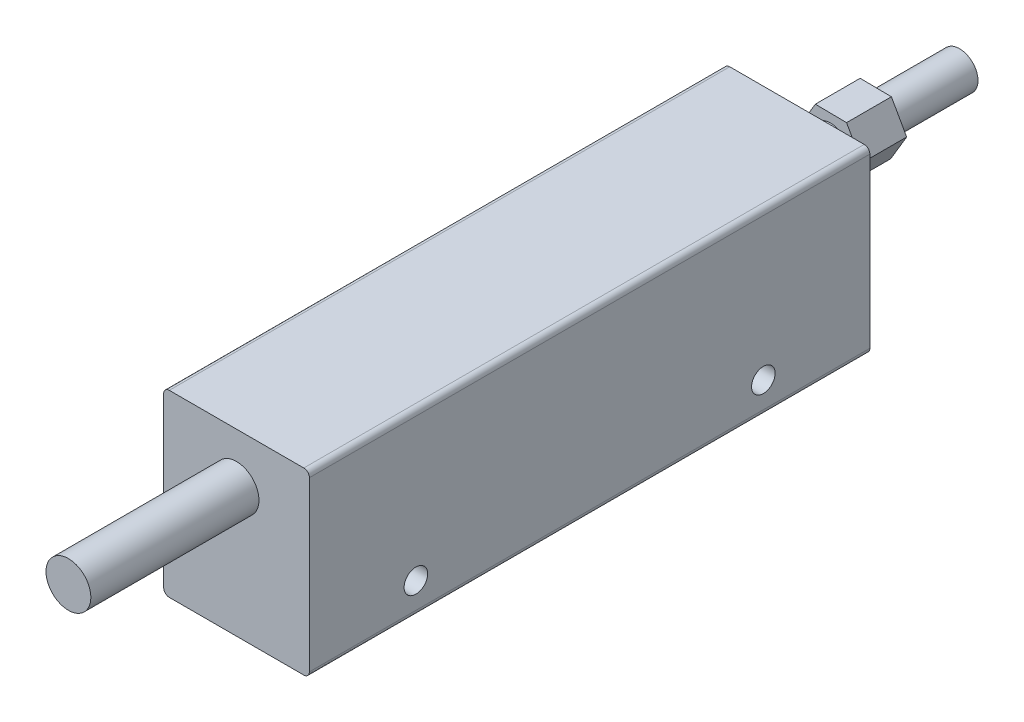
ISO-10303-21;
HEADER;
FILE_DESCRIPTION(('STEP AP214'),'2;1');
FILE_NAME('part.step','',(''),(''),'','','');
FILE_SCHEMA(('AUTOMOTIVE_DESIGN { 1 0 10303 214 1 1 1 1 }'));
ENDSEC;
DATA;
#1=APPLICATION_CONTEXT('core data for automotive mechanical design processes');
#2=APPLICATION_PROTOCOL_DEFINITION('international standard','automotive_design',2000,#1);
#3=PRODUCT_CONTEXT('',#1,'mechanical');
#4=PRODUCT('Part','Part','',(#3));
#5=PRODUCT_RELATED_PRODUCT_CATEGORY('part','',(#4));
#6=PRODUCT_DEFINITION_FORMATION('','',#4);
#7=PRODUCT_DEFINITION_CONTEXT('part definition',#1,'design');
#8=PRODUCT_DEFINITION('design','',#6,#7);
#9=PRODUCT_DEFINITION_SHAPE('','',#8);
#10=(LENGTH_UNIT() NAMED_UNIT(*) SI_UNIT(.MILLI.,.METRE.));
#11=(NAMED_UNIT(*) PLANE_ANGLE_UNIT() SI_UNIT($,.RADIAN.));
#12=(NAMED_UNIT(*) SI_UNIT($,.STERADIAN.) SOLID_ANGLE_UNIT());
#13=UNCERTAINTY_MEASURE_WITH_UNIT(LENGTH_MEASURE(1.E-05),#10,'distance_accuracy_value','');
#14=(GEOMETRIC_REPRESENTATION_CONTEXT(3) GLOBAL_UNCERTAINTY_ASSIGNED_CONTEXT((#13)) GLOBAL_UNIT_ASSIGNED_CONTEXT((#10,
#11,#12)) REPRESENTATION_CONTEXT('',''));
#15=CARTESIAN_POINT('',(0.,0.,0.));
#16=DIRECTION('',(0.,0.,1.));
#17=DIRECTION('',(1.,0.,0.));
#18=AXIS2_PLACEMENT_3D('',#15,#16,#17);
#19=CARTESIAN_POINT('',(6.5,11.5,-14.5));
#20=DIRECTION('',(0.,0.,1.));
#21=DIRECTION('',(1.,0.,0.));
#22=AXIS2_PLACEMENT_3D('',#19,#20,#21);
#23=CYLINDRICAL_SURFACE('',#22,1.65);
#24=CARTESIAN_POINT('',(6.5,11.5,0.));
#25=DIRECTION('',(0.,0.,-1.));
#26=DIRECTION('',(-1.,0.,0.));
#27=AXIS2_PLACEMENT_3D('',#24,#25,#26);
#28=CIRCLE('',#27,1.65);
#29=CARTESIAN_POINT('',(8.15,11.5,0.));
#30=VERTEX_POINT('',#29);
#31=EDGE_CURVE('E226',#30,#30,#28,.T.);
#32=CARTESIAN_POINT('',(6.5,11.5,-3.));
#33=DIRECTION('',(0.,0.,-1.));
#34=DIRECTION('',(-1.,0.,0.));
#35=AXIS2_PLACEMENT_3D('',#32,#33,#34);
#36=CIRCLE('',#35,1.65);
#37=CARTESIAN_POINT('',(8.15,11.5,-3.));
#38=VERTEX_POINT('',#37);
#39=EDGE_CURVE('E11',#38,#38,#36,.T.);
#40=CARTESIAN_POINT('',(8.15,11.5,0.));
#41=CARTESIAN_POINT('',(8.15,11.5,-0.03125));
#42=CARTESIAN_POINT('',(8.15,11.5,-0.0625000000000001));
#43=CARTESIAN_POINT('',(8.15,11.5,-0.125));
#44=CARTESIAN_POINT('',(8.15,11.5,-0.15625));
#45=CARTESIAN_POINT('',(8.15,11.5,-0.21875));
#46=CARTESIAN_POINT('',(8.15,11.5,-0.25));
#47=CARTESIAN_POINT('',(8.15,11.5,-0.3125));
#48=CARTESIAN_POINT('',(8.15,11.5,-0.34375));
#49=CARTESIAN_POINT('',(8.15,11.5,-0.40625));
#50=CARTESIAN_POINT('',(8.15,11.5,-0.4375));
#51=CARTESIAN_POINT('',(8.15,11.5,-0.5));
#52=CARTESIAN_POINT('',(8.15,11.5,-0.53125));
#53=CARTESIAN_POINT('',(8.15,11.5,-0.593750000000001));
#54=CARTESIAN_POINT('',(8.15,11.5,-0.625000000000001));
#55=CARTESIAN_POINT('',(8.15,11.5,-0.687500000000001));
#56=CARTESIAN_POINT('',(8.15,11.5,-0.718750000000001));
#57=CARTESIAN_POINT('',(8.15,11.5,-0.78125));
#58=CARTESIAN_POINT('',(8.15,11.5,-0.8125));
#59=CARTESIAN_POINT('',(8.15,11.5,-0.874999999999999));
#60=CARTESIAN_POINT('',(8.15,11.5,-0.906249999999999));
#61=CARTESIAN_POINT('',(8.15,11.5,-0.968749999999999));
#62=CARTESIAN_POINT('',(8.15,11.5,-0.999999999999999));
#63=CARTESIAN_POINT('',(8.15,11.5,-1.0625));
#64=CARTESIAN_POINT('',(8.15,11.5,-1.09375));
#65=CARTESIAN_POINT('',(8.15,11.5,-1.15625));
#66=CARTESIAN_POINT('',(8.15,11.5,-1.1875));
#67=CARTESIAN_POINT('',(8.15,11.5,-1.25));
#68=CARTESIAN_POINT('',(8.15,11.5,-1.28125));
#69=CARTESIAN_POINT('',(8.15,11.5,-1.34375));
#70=CARTESIAN_POINT('',(8.15,11.5,-1.375));
#71=CARTESIAN_POINT('',(8.15,11.5,-1.4375));
#72=CARTESIAN_POINT('',(8.15,11.5,-1.46875));
#73=CARTESIAN_POINT('',(8.15,11.5,-1.53125));
#74=CARTESIAN_POINT('',(8.15,11.5,-1.5625));
#75=CARTESIAN_POINT('',(8.15,11.5,-1.625));
#76=CARTESIAN_POINT('',(8.15,11.5,-1.65625));
#77=CARTESIAN_POINT('',(8.15,11.5,-1.71875));
#78=CARTESIAN_POINT('',(8.15,11.5,-1.75));
#79=CARTESIAN_POINT('',(8.15,11.5,-1.8125));
#80=CARTESIAN_POINT('',(8.15,11.5,-1.84375));
#81=CARTESIAN_POINT('',(8.15,11.5,-1.90625));
#82=CARTESIAN_POINT('',(8.15,11.5,-1.9375));
#83=CARTESIAN_POINT('',(8.15,11.5,-2.));
#84=CARTESIAN_POINT('',(8.15,11.5,-2.03125));
#85=CARTESIAN_POINT('',(8.15,11.5,-2.09375));
#86=CARTESIAN_POINT('',(8.15,11.5,-2.125));
#87=CARTESIAN_POINT('',(8.15,11.5,-2.1875));
#88=CARTESIAN_POINT('',(8.15,11.5,-2.21875));
#89=CARTESIAN_POINT('',(8.15,11.5,-2.28125));
#90=CARTESIAN_POINT('',(8.15,11.5,-2.3125));
#91=CARTESIAN_POINT('',(8.15,11.5,-2.375));
#92=CARTESIAN_POINT('',(8.15,11.5,-2.40625));
#93=CARTESIAN_POINT('',(8.15,11.5,-2.46875));
#94=CARTESIAN_POINT('',(8.15,11.5,-2.5));
#95=CARTESIAN_POINT('',(8.15,11.5,-2.5625));
#96=CARTESIAN_POINT('',(8.15,11.5,-2.59375));
#97=CARTESIAN_POINT('',(8.15,11.5,-2.65625));
#98=CARTESIAN_POINT('',(8.15,11.5,-2.6875));
#99=CARTESIAN_POINT('',(8.15,11.5,-2.75));
#100=CARTESIAN_POINT('',(8.15,11.5,-2.78125));
#101=CARTESIAN_POINT('',(8.15,11.5,-2.84375));
#102=CARTESIAN_POINT('',(8.15,11.5,-2.875));
#103=CARTESIAN_POINT('',(8.15,11.5,-2.9375));
#104=CARTESIAN_POINT('',(8.15,11.5,-2.96875));
#105=CARTESIAN_POINT('',(8.15,11.5,-3.));
#106=B_SPLINE_CURVE_WITH_KNOTS('',3,(#40,#41,#42,#43,#44,#45,#46,#47,#48,#49,#50,#51,#52,#53,
#54,#55,#56,#57,#58,#59,#60,#61,#62,#63,#64,#65,#66,#67,#68,#69,#70,#71,#72,#73,#74,#75,#76,#77,
#78,#79,#80,#81,#82,#83,#84,#85,#86,#87,#88,#89,#90,#91,#92,#93,#94,#95,#96,#97,#98,#99,#100,
#101,#102,#103,#104,#105),.UNSPECIFIED.,.F.,.F.,(4,2,2,2,2,2,2,2,2,2,2,2,2,2,2,2,2,2,2,2,2,2,2,
2,2,2,2,2,2,2,2,2,4),(0.,0.0937500000000001,0.1875,0.28125,0.375,0.46875,0.5625,
0.656250000000001,0.750000000000001,0.843749999999999,0.937499999999999,1.03125,1.125,1.21875,
1.3125,1.40625,1.5,1.59375,1.6875,1.78125,1.875,1.96875,2.0625,2.15625,2.25,2.34375,2.4375,
2.53125,2.625,2.71875,2.8125,2.90625,3.),.UNSPECIFIED.);
#107=EDGE_CURVE('BSEAM39',#30,#38,#106,.T.);
#108=ORIENTED_EDGE('',*,*,#31,.T.);
#109=ORIENTED_EDGE('',*,*,#39,.F.);
#110=ORIENTED_EDGE('',*,*,#107,.T.);
#111=ORIENTED_EDGE('',*,*,#107,.F.);
#112=EDGE_LOOP('',(#108,#110,#109,#111));
#113=FACE_BOUND('',#112,.T.);
#114=ADVANCED_FACE('F39',(#113),#23,.T.);
#115=CARTESIAN_POINT('',(0.,0.,50.));
#116=DIRECTION('',(1.,0.,0.));
#117=DIRECTION('',(0.,0.,-1.));
#118=AXIS2_PLACEMENT_3D('',#115,#116,#117);
#119=PLANE('',#118);
#120=CARTESIAN_POINT('',(0.,2.8,40.5));
#121=DIRECTION('',(1.,0.,0.));
#122=DIRECTION('',(0.,1.,0.));
#123=AXIS2_PLACEMENT_3D('',#120,#121,#122);
#124=CIRCLE('',#123,1.05);
#125=CARTESIAN_POINT('',(0.,3.85,40.5));
#126=VERTEX_POINT('',#125);
#127=EDGE_CURVE('E234',#126,#126,#124,.T.);
#128=ORIENTED_EDGE('',*,*,#127,.T.);
#129=EDGE_LOOP('',(#128));
#130=FACE_BOUND('',#129,.T.);
#131=CARTESIAN_POINT('',(0.,2.8,9.5));
#132=DIRECTION('',(1.,0.,0.));
#133=DIRECTION('',(0.,1.,0.));
#134=AXIS2_PLACEMENT_3D('',#131,#132,#133);
#135=CIRCLE('',#134,1.05);
#136=CARTESIAN_POINT('',(0.,3.85,9.5));
#137=VERTEX_POINT('',#136);
#138=EDGE_CURVE('E243',#137,#137,#135,.T.);
#139=ORIENTED_EDGE('',*,*,#138,.T.);
#140=EDGE_LOOP('',(#139));
#141=FACE_BOUND('',#140,.T.);
#142=DIRECTION('',(0.,-1.,0.));
#143=VECTOR('',#142,1.);
#144=CARTESIAN_POINT('',(0.,0.,0.));
#145=LINE('',#144,#143);
#146=CARTESIAN_POINT('',(0.,15.5,0.));
#147=VERTEX_POINT('',#146);
#148=CARTESIAN_POINT('',(0.,0.5,0.));
#149=VERTEX_POINT('',#148);
#150=EDGE_CURVE('E238',#147,#149,#145,.T.);
#151=ORIENTED_EDGE('',*,*,#150,.T.);
#152=DIRECTION('',(0.,0.,-1.));
#153=VECTOR('',#152,1.);
#154=CARTESIAN_POINT('',(0.,0.5,50.));
#155=LINE('',#154,#153);
#156=CARTESIAN_POINT('',(0.,0.5,50.));
#157=VERTEX_POINT('',#156);
#158=EDGE_CURVE('E323',#149,#157,#155,.F.);
#159=ORIENTED_EDGE('',*,*,#158,.T.);
#160=DIRECTION('',(0.,-1.,0.));
#161=VECTOR('',#160,1.);
#162=CARTESIAN_POINT('',(0.,0.,50.));
#163=LINE('',#162,#161);
#164=CARTESIAN_POINT('',(0.,15.5,50.));
#165=VERTEX_POINT('',#164);
#166=EDGE_CURVE('E250',#165,#157,#163,.T.);
#167=ORIENTED_EDGE('',*,*,#166,.F.);
#168=DIRECTION('',(0.,0.,-1.));
#169=VECTOR('',#168,1.);
#170=CARTESIAN_POINT('',(0.,15.5,50.));
#171=LINE('',#170,#169);
#172=EDGE_CURVE('E319',#165,#147,#171,.T.);
#173=ORIENTED_EDGE('',*,*,#172,.T.);
#174=EDGE_LOOP('',(#151,#159,#167,#173));
#175=FACE_BOUND('',#174,.T.);
#176=ADVANCED_FACE('F364',(#130,#141,#175),#119,.F.);
#177=CARTESIAN_POINT('',(0.,0.,50.));
#178=DIRECTION('',(0.,1.,0.));
#179=DIRECTION('',(0.,0.,1.));
#180=AXIS2_PLACEMENT_3D('',#177,#178,#179);
#181=PLANE('',#180);
#182=DIRECTION('',(1.,0.,0.));
#183=VECTOR('',#182,1.);
#184=CARTESIAN_POINT('',(0.,0.,0.));
#185=LINE('',#184,#183);
#186=CARTESIAN_POINT('',(0.5,0.,0.));
#187=VERTEX_POINT('',#186);
#188=CARTESIAN_POINT('',(12.5,0.,0.));
#189=VERTEX_POINT('',#188);
#190=EDGE_CURVE('E269',#187,#189,#185,.T.);
#191=ORIENTED_EDGE('',*,*,#190,.T.);
#192=DIRECTION('',(0.,0.,-1.));
#193=VECTOR('',#192,1.);
#194=CARTESIAN_POINT('',(12.5,0.,50.));
#195=LINE('',#194,#193);
#196=CARTESIAN_POINT('',(12.5,0.,50.));
#197=VERTEX_POINT('',#196);
#198=EDGE_CURVE('E305',#189,#197,#195,.F.);
#199=ORIENTED_EDGE('',*,*,#198,.T.);
#200=DIRECTION('',(1.,0.,0.));
#201=VECTOR('',#200,1.);
#202=CARTESIAN_POINT('',(0.,0.,50.));
#203=LINE('',#202,#201);
#204=CARTESIAN_POINT('',(0.5,0.,50.));
#205=VERTEX_POINT('',#204);
#206=EDGE_CURVE('E254',#205,#197,#203,.T.);
#207=ORIENTED_EDGE('',*,*,#206,.F.);
#208=DIRECTION('',(0.,0.,-1.));
#209=VECTOR('',#208,1.);
#210=CARTESIAN_POINT('',(0.5,0.,50.));
#211=LINE('',#210,#209);
#212=EDGE_CURVE('E301',#205,#187,#211,.T.);
#213=ORIENTED_EDGE('',*,*,#212,.T.);
#214=EDGE_LOOP('',(#191,#199,#207,#213));
#215=FACE_BOUND('',#214,.T.);
#216=ADVANCED_FACE('F370',(#215),#181,.F.);
#217=CARTESIAN_POINT('',(13.,0.,50.));
#218=DIRECTION('',(-1.,0.,0.));
#219=DIRECTION('',(0.,-1.,0.));
#220=AXIS2_PLACEMENT_3D('',#217,#218,#219);
#221=PLANE('',#220);
#222=CARTESIAN_POINT('',(13.,2.8,40.5));
#223=DIRECTION('',(1.,0.,0.));
#224=DIRECTION('',(0.,1.,0.));
#225=AXIS2_PLACEMENT_3D('',#222,#223,#224);
#226=CIRCLE('',#225,1.05);
#227=CARTESIAN_POINT('',(13.,3.85,40.5));
#228=VERTEX_POINT('',#227);
#229=EDGE_CURVE('E239',#228,#228,#226,.T.);
#230=ORIENTED_EDGE('',*,*,#229,.F.);
#231=EDGE_LOOP('',(#230));
#232=FACE_BOUND('',#231,.T.);
#233=CARTESIAN_POINT('',(13.,2.8,9.5));
#234=DIRECTION('',(1.,0.,0.));
#235=DIRECTION('',(0.,1.,0.));
#236=AXIS2_PLACEMENT_3D('',#233,#234,#235);
#237=CIRCLE('',#236,1.05);
#238=CARTESIAN_POINT('',(13.,3.85,9.5));
#239=VERTEX_POINT('',#238);
#240=EDGE_CURVE('E233',#239,#239,#237,.T.);
#241=ORIENTED_EDGE('',*,*,#240,.F.);
#242=EDGE_LOOP('',(#241));
#243=FACE_BOUND('',#242,.T.);
#244=DIRECTION('',(0.,1.,0.));
#245=VECTOR('',#244,1.);
#246=CARTESIAN_POINT('',(13.,0.,50.));
#247=LINE('',#246,#245);
#248=CARTESIAN_POINT('',(13.,0.5,50.));
#249=VERTEX_POINT('',#248);
#250=CARTESIAN_POINT('',(13.,15.5,50.));
#251=VERTEX_POINT('',#250);
#252=EDGE_CURVE('E259',#249,#251,#247,.T.);
#253=ORIENTED_EDGE('',*,*,#252,.F.);
#254=DIRECTION('',(0.,0.,-1.));
#255=VECTOR('',#254,1.);
#256=CARTESIAN_POINT('',(13.,0.5,50.));
#257=LINE('',#256,#255);
#258=CARTESIAN_POINT('',(13.,0.5,0.));
#259=VERTEX_POINT('',#258);
#260=EDGE_CURVE('E285',#249,#259,#257,.T.);
#261=ORIENTED_EDGE('',*,*,#260,.T.);
#262=DIRECTION('',(0.,1.,0.));
#263=VECTOR('',#262,1.);
#264=CARTESIAN_POINT('',(13.,0.,0.));
#265=LINE('',#264,#263);
#266=CARTESIAN_POINT('',(13.,15.5,0.));
#267=VERTEX_POINT('',#266);
#268=EDGE_CURVE('E273',#259,#267,#265,.T.);
#269=ORIENTED_EDGE('',*,*,#268,.T.);
#270=DIRECTION('',(0.,0.,-1.));
#271=VECTOR('',#270,1.);
#272=CARTESIAN_POINT('',(13.,15.5,50.));
#273=LINE('',#272,#271);
#274=EDGE_CURVE('E282',#267,#251,#273,.F.);
#275=ORIENTED_EDGE('',*,*,#274,.T.);
#276=EDGE_LOOP('',(#253,#261,#269,#275));
#277=FACE_BOUND('',#276,.T.);
#278=ADVANCED_FACE('F417',(#232,#243,#277),#221,.F.);
#279=CARTESIAN_POINT('',(0.,16.,50.));
#280=DIRECTION('',(0.,-1.,0.));
#281=DIRECTION('',(0.,0.,-1.));
#282=AXIS2_PLACEMENT_3D('',#279,#280,#281);
#283=PLANE('',#282);
#284=DIRECTION('',(-1.,0.,0.));
#285=VECTOR('',#284,1.);
#286=CARTESIAN_POINT('',(0.,16.,50.));
#287=LINE('',#286,#285);
#288=CARTESIAN_POINT('',(12.5,16.,50.));
#289=VERTEX_POINT('',#288);
#290=CARTESIAN_POINT('',(0.5,16.,50.));
#291=VERTEX_POINT('',#290);
#292=EDGE_CURVE('E262',#289,#291,#287,.T.);
#293=ORIENTED_EDGE('',*,*,#292,.F.);
#294=DIRECTION('',(0.,0.,-1.));
#295=VECTOR('',#294,1.);
#296=CARTESIAN_POINT('',(12.5,16.,50.));
#297=LINE('',#296,#295);
#298=CARTESIAN_POINT('',(12.5,16.,0.));
#299=VERTEX_POINT('',#298);
#300=EDGE_CURVE('E48',#289,#299,#297,.T.);
#301=ORIENTED_EDGE('',*,*,#300,.T.);
#302=DIRECTION('',(-1.,0.,0.));
#303=VECTOR('',#302,1.);
#304=CARTESIAN_POINT('',(0.,16.,0.));
#305=LINE('',#304,#303);
#306=CARTESIAN_POINT('',(0.5,16.,0.));
#307=VERTEX_POINT('',#306);
#308=EDGE_CURVE('E255',#299,#307,#305,.T.);
#309=ORIENTED_EDGE('',*,*,#308,.T.);
#310=DIRECTION('',(0.,0.,-1.));
#311=VECTOR('',#310,1.);
#312=CARTESIAN_POINT('',(0.5,16.,50.));
#313=LINE('',#312,#311);
#314=EDGE_CURVE('E55',#307,#291,#313,.F.);
#315=ORIENTED_EDGE('',*,*,#314,.T.);
#316=EDGE_LOOP('',(#293,#301,#309,#315));
#317=FACE_BOUND('',#316,.T.);
#318=ADVANCED_FACE('F422',(#317),#283,.F.);
#319=CARTESIAN_POINT('',(0.,0.,50.));
#320=DIRECTION('',(0.,0.,-1.));
#321=DIRECTION('',(-1.,0.,0.));
#322=AXIS2_PLACEMENT_3D('',#319,#320,#321);
#323=PLANE('',#322);
#324=CARTESIAN_POINT('',(6.5,11.5,50.));
#325=DIRECTION('',(0.,0.,-1.));
#326=DIRECTION('',(-1.,0.,0.));
#327=AXIS2_PLACEMENT_3D('',#324,#325,#326);
#328=CIRCLE('',#327,2.);
#329=CARTESIAN_POINT('',(4.5,11.5,50.));
#330=VERTEX_POINT('',#329);
#331=EDGE_CURVE('E265',#330,#330,#328,.F.);
#332=ORIENTED_EDGE('',*,*,#331,.F.);
#333=EDGE_LOOP('',(#332));
#334=FACE_BOUND('',#333,.T.);
#335=ORIENTED_EDGE('',*,*,#206,.T.);
#336=CARTESIAN_POINT('',(12.5,0.5,50.));
#337=DIRECTION('',(0.,0.,-1.));
#338=DIRECTION('',(-1.,0.,0.));
#339=AXIS2_PLACEMENT_3D('',#336,#337,#338);
#340=CIRCLE('',#339,0.5);
#341=EDGE_CURVE('E316',#197,#249,#340,.F.);
#342=ORIENTED_EDGE('',*,*,#341,.T.);
#343=ORIENTED_EDGE('',*,*,#252,.T.);
#344=CARTESIAN_POINT('',(12.5,15.5,50.));
#345=DIRECTION('',(0.,0.,-1.));
#346=DIRECTION('',(-1.,0.,0.));
#347=AXIS2_PLACEMENT_3D('',#344,#345,#346);
#348=CIRCLE('',#347,0.5);
#349=EDGE_CURVE('E62',#251,#289,#348,.F.);
#350=ORIENTED_EDGE('',*,*,#349,.T.);
#351=ORIENTED_EDGE('',*,*,#292,.T.);
#352=CARTESIAN_POINT('',(0.5,15.5,50.));
#353=DIRECTION('',(0.,0.,-1.));
#354=DIRECTION('',(-1.,0.,0.));
#355=AXIS2_PLACEMENT_3D('',#352,#353,#354);
#356=CIRCLE('',#355,0.5);
#357=EDGE_CURVE('E308',#291,#165,#356,.F.);
#358=ORIENTED_EDGE('',*,*,#357,.T.);
#359=ORIENTED_EDGE('',*,*,#166,.T.);
#360=CARTESIAN_POINT('',(0.5,0.5,50.));
#361=DIRECTION('',(0.,0.,-1.));
#362=DIRECTION('',(-1.,0.,0.));
#363=AXIS2_PLACEMENT_3D('',#360,#361,#362);
#364=CIRCLE('',#363,0.5);
#365=EDGE_CURVE('E313',#157,#205,#364,.F.);
#366=ORIENTED_EDGE('',*,*,#365,.T.);
#367=EDGE_LOOP('',(#335,#342,#343,#350,#351,#358,#359,#366));
#368=FACE_BOUND('',#367,.T.);
#369=ADVANCED_FACE('F400',(#334,#368),#323,.F.);
#370=CARTESIAN_POINT('',(0.,0.,0.));
#371=DIRECTION('',(0.,0.,-1.));
#372=DIRECTION('',(-1.,0.,0.));
#373=AXIS2_PLACEMENT_3D('',#370,#371,#372);
#374=PLANE('',#373);
#375=ORIENTED_EDGE('',*,*,#31,.F.);
#376=EDGE_LOOP('',(#375));
#377=FACE_BOUND('',#376,.T.);
#378=ORIENTED_EDGE('',*,*,#268,.F.);
#379=CARTESIAN_POINT('',(12.5,0.5,0.));
#380=DIRECTION('',(0.,0.,-1.));
#381=DIRECTION('',(-1.,0.,0.));
#382=AXIS2_PLACEMENT_3D('',#379,#380,#381);
#383=CIRCLE('',#382,0.5);
#384=EDGE_CURVE('E298',#259,#189,#383,.T.);
#385=ORIENTED_EDGE('',*,*,#384,.T.);
#386=ORIENTED_EDGE('',*,*,#190,.F.);
#387=CARTESIAN_POINT('',(0.5,0.5,0.));
#388=DIRECTION('',(0.,0.,-1.));
#389=DIRECTION('',(-1.,0.,0.));
#390=AXIS2_PLACEMENT_3D('',#387,#388,#389);
#391=CIRCLE('',#390,0.5);
#392=EDGE_CURVE('E295',#187,#149,#391,.T.);
#393=ORIENTED_EDGE('',*,*,#392,.T.);
#394=ORIENTED_EDGE('',*,*,#150,.F.);
#395=CARTESIAN_POINT('',(0.5,15.5,0.));
#396=DIRECTION('',(0.,0.,-1.));
#397=DIRECTION('',(-1.,0.,0.));
#398=AXIS2_PLACEMENT_3D('',#395,#396,#397);
#399=CIRCLE('',#398,0.5);
#400=EDGE_CURVE('E289',#147,#307,#399,.T.);
#401=ORIENTED_EDGE('',*,*,#400,.T.);
#402=ORIENTED_EDGE('',*,*,#308,.F.);
#403=CARTESIAN_POINT('',(12.5,15.5,0.));
#404=DIRECTION('',(0.,0.,-1.));
#405=DIRECTION('',(-1.,0.,0.));
#406=AXIS2_PLACEMENT_3D('',#403,#404,#405);
#407=CIRCLE('',#406,0.5);
#408=EDGE_CURVE('E292',#299,#267,#407,.T.);
#409=ORIENTED_EDGE('',*,*,#408,.T.);
#410=EDGE_LOOP('',(#378,#385,#386,#393,#394,#401,#402,#409));
#411=FACE_BOUND('',#410,.T.);
#412=ADVANCED_FACE('F424',(#377,#411),#374,.T.);
#413=CARTESIAN_POINT('',(0.,2.8,9.5));
#414=DIRECTION('',(1.,0.,0.));
#415=DIRECTION('',(0.,1.,0.));
#416=AXIS2_PLACEMENT_3D('',#413,#414,#415);
#417=CYLINDRICAL_SURFACE('',#416,1.05);
#418=CARTESIAN_POINT('',(0.,3.85,9.5));
#419=CARTESIAN_POINT('',(0.135416666666666,3.85,9.5));
#420=CARTESIAN_POINT('',(0.270833333333333,3.85,9.5));
#421=CARTESIAN_POINT('',(0.541666666666666,3.85,9.5));
#422=CARTESIAN_POINT('',(0.677083333333333,3.85,9.5));
#423=CARTESIAN_POINT('',(0.947916666666666,3.85,9.5));
#424=CARTESIAN_POINT('',(1.08333333333333,3.85,9.5));
#425=CARTESIAN_POINT('',(1.35416666666667,3.85,9.5));
#426=CARTESIAN_POINT('',(1.48958333333333,3.85,9.5));
#427=CARTESIAN_POINT('',(1.76041666666667,3.85,9.5));
#428=CARTESIAN_POINT('',(1.89583333333333,3.85,9.5));
#429=CARTESIAN_POINT('',(2.16666666666667,3.85,9.5));
#430=CARTESIAN_POINT('',(2.30208333333333,3.85,9.5));
#431=CARTESIAN_POINT('',(2.57291666666667,3.85,9.5));
#432=CARTESIAN_POINT('',(2.70833333333333,3.85,9.5));
#433=CARTESIAN_POINT('',(2.97916666666667,3.85,9.5));
#434=CARTESIAN_POINT('',(3.11458333333333,3.85,9.5));
#435=CARTESIAN_POINT('',(3.38541666666667,3.85,9.5));
#436=CARTESIAN_POINT('',(3.52083333333333,3.85,9.5));
#437=CARTESIAN_POINT('',(3.79166666666667,3.85,9.5));
#438=CARTESIAN_POINT('',(3.92708333333333,3.85,9.5));
#439=CARTESIAN_POINT('',(4.19791666666667,3.85,9.5));
#440=CARTESIAN_POINT('',(4.33333333333333,3.85,9.5));
#441=CARTESIAN_POINT('',(4.60416666666667,3.85,9.5));
#442=CARTESIAN_POINT('',(4.73958333333333,3.85,9.5));
#443=CARTESIAN_POINT('',(5.01041666666667,3.85,9.5));
#444=CARTESIAN_POINT('',(5.14583333333333,3.85,9.5));
#445=CARTESIAN_POINT('',(5.41666666666667,3.85,9.5));
#446=CARTESIAN_POINT('',(5.55208333333333,3.85,9.5));
#447=CARTESIAN_POINT('',(5.82291666666667,3.85,9.5));
#448=CARTESIAN_POINT('',(5.95833333333333,3.85,9.5));
#449=CARTESIAN_POINT('',(6.22916666666667,3.85,9.5));
#450=CARTESIAN_POINT('',(6.36458333333333,3.85,9.5));
#451=CARTESIAN_POINT('',(6.63541666666667,3.85,9.5));
#452=CARTESIAN_POINT('',(6.77083333333333,3.85,9.5));
#453=CARTESIAN_POINT('',(7.04166666666667,3.85,9.5));
#454=CARTESIAN_POINT('',(7.17708333333333,3.85,9.5));
#455=CARTESIAN_POINT('',(7.44791666666667,3.85,9.5));
#456=CARTESIAN_POINT('',(7.58333333333333,3.85,9.5));
#457=CARTESIAN_POINT('',(7.85416666666667,3.85,9.5));
#458=CARTESIAN_POINT('',(7.98958333333333,3.85,9.5));
#459=CARTESIAN_POINT('',(8.26041666666667,3.85,9.5));
#460=CARTESIAN_POINT('',(8.39583333333333,3.85,9.5));
#461=CARTESIAN_POINT('',(8.66666666666667,3.85,9.5));
#462=CARTESIAN_POINT('',(8.80208333333333,3.85,9.5));
#463=CARTESIAN_POINT('',(9.07291666666667,3.85,9.5));
#464=CARTESIAN_POINT('',(9.20833333333333,3.85,9.5));
#465=CARTESIAN_POINT('',(9.47916666666667,3.85,9.5));
#466=CARTESIAN_POINT('',(9.61458333333333,3.85,9.5));
#467=CARTESIAN_POINT('',(9.88541666666667,3.85,9.5));
#468=CARTESIAN_POINT('',(10.0208333333333,3.85,9.5));
#469=CARTESIAN_POINT('',(10.2916666666667,3.85,9.5));
#470=CARTESIAN_POINT('',(10.4270833333333,3.85,9.5));
#471=CARTESIAN_POINT('',(10.6979166666667,3.85,9.5));
#472=CARTESIAN_POINT('',(10.8333333333333,3.85,9.5));
#473=CARTESIAN_POINT('',(11.1041666666667,3.85,9.5));
#474=CARTESIAN_POINT('',(11.2395833333333,3.85,9.5));
#475=CARTESIAN_POINT('',(11.5104166666667,3.85,9.5));
#476=CARTESIAN_POINT('',(11.6458333333333,3.85,9.5));
#477=CARTESIAN_POINT('',(11.9166666666667,3.85,9.5));
#478=CARTESIAN_POINT('',(12.0520833333333,3.85,9.5));
#479=CARTESIAN_POINT('',(12.3229166666667,3.85,9.5));
#480=CARTESIAN_POINT('',(12.4583333333333,3.85,9.5));
#481=CARTESIAN_POINT('',(12.7291666666667,3.85,9.5));
#482=CARTESIAN_POINT('',(12.8645833333333,3.85,9.5));
#483=CARTESIAN_POINT('',(13.,3.85,9.5));
#484=B_SPLINE_CURVE_WITH_KNOTS('',3,(#418,#419,#420,#421,#422,#423,#424,#425,#426,#427,#428,
#429,#430,#431,#432,#433,#434,#435,#436,#437,#438,#439,#440,#441,#442,#443,#444,#445,#446,#447,
#448,#449,#450,#451,#452,#453,#454,#455,#456,#457,#458,#459,#460,#461,#462,#463,#464,#465,#466,
#467,#468,#469,#470,#471,#472,#473,#474,#475,#476,#477,#478,#479,#480,#481,#482,#483),
.UNSPECIFIED.,.F.,.F.,(4,2,2,2,2,2,2,2,2,2,2,2,2,2,2,2,2,2,2,2,2,2,2,2,2,2,2,2,2,2,2,2,4),(0.,
0.40625,0.8125,1.21875,1.625,2.03125,2.4375,2.84375,3.25,3.65625,4.0625,4.46875,4.875,5.28125,
5.6875,6.09375,6.5,6.90625,7.3125,7.71875,8.125,8.53125,8.9375,9.34375,9.75,10.15625,10.5625,
10.96875,11.375,11.78125,12.1875,12.59375,13.),.UNSPECIFIED.);
#485=EDGE_CURVE('BSEAM426',#137,#239,#484,.T.);
#486=ORIENTED_EDGE('',*,*,#138,.F.);
#487=ORIENTED_EDGE('',*,*,#240,.T.);
#488=ORIENTED_EDGE('',*,*,#485,.T.);
#489=ORIENTED_EDGE('',*,*,#485,.F.);
#490=EDGE_LOOP('',(#486,#488,#487,#489));
#491=FACE_BOUND('',#490,.T.);
#492=ADVANCED_FACE('F426',(#491),#417,.F.);
#493=CARTESIAN_POINT('',(0.,2.8,40.5));
#494=DIRECTION('',(1.,0.,0.));
#495=DIRECTION('',(0.,1.,0.));
#496=AXIS2_PLACEMENT_3D('',#493,#494,#495);
#497=CYLINDRICAL_SURFACE('',#496,1.05);
#498=CARTESIAN_POINT('',(0.,3.85,40.5));
#499=CARTESIAN_POINT('',(0.135416666666666,3.85,40.5));
#500=CARTESIAN_POINT('',(0.270833333333333,3.85,40.5));
#501=CARTESIAN_POINT('',(0.541666666666666,3.85,40.5));
#502=CARTESIAN_POINT('',(0.677083333333333,3.85,40.5));
#503=CARTESIAN_POINT('',(0.947916666666666,3.85,40.5));
#504=CARTESIAN_POINT('',(1.08333333333333,3.85,40.5));
#505=CARTESIAN_POINT('',(1.35416666666667,3.85,40.5));
#506=CARTESIAN_POINT('',(1.48958333333333,3.85,40.5));
#507=CARTESIAN_POINT('',(1.76041666666667,3.85,40.5));
#508=CARTESIAN_POINT('',(1.89583333333333,3.85,40.5));
#509=CARTESIAN_POINT('',(2.16666666666667,3.85,40.5));
#510=CARTESIAN_POINT('',(2.30208333333333,3.85,40.5));
#511=CARTESIAN_POINT('',(2.57291666666667,3.85,40.5));
#512=CARTESIAN_POINT('',(2.70833333333333,3.85,40.5));
#513=CARTESIAN_POINT('',(2.97916666666667,3.85,40.5));
#514=CARTESIAN_POINT('',(3.11458333333333,3.85,40.5));
#515=CARTESIAN_POINT('',(3.38541666666667,3.85,40.5));
#516=CARTESIAN_POINT('',(3.52083333333333,3.85,40.5));
#517=CARTESIAN_POINT('',(3.79166666666667,3.85,40.5));
#518=CARTESIAN_POINT('',(3.92708333333333,3.85,40.5));
#519=CARTESIAN_POINT('',(4.19791666666667,3.85,40.5));
#520=CARTESIAN_POINT('',(4.33333333333333,3.85,40.5));
#521=CARTESIAN_POINT('',(4.60416666666667,3.85,40.5));
#522=CARTESIAN_POINT('',(4.73958333333333,3.85,40.5));
#523=CARTESIAN_POINT('',(5.01041666666667,3.85,40.5));
#524=CARTESIAN_POINT('',(5.14583333333333,3.85,40.5));
#525=CARTESIAN_POINT('',(5.41666666666667,3.85,40.5));
#526=CARTESIAN_POINT('',(5.55208333333333,3.85,40.5));
#527=CARTESIAN_POINT('',(5.82291666666667,3.85,40.5));
#528=CARTESIAN_POINT('',(5.95833333333333,3.85,40.5));
#529=CARTESIAN_POINT('',(6.22916666666667,3.85,40.5));
#530=CARTESIAN_POINT('',(6.36458333333333,3.85,40.5));
#531=CARTESIAN_POINT('',(6.63541666666667,3.85,40.5));
#532=CARTESIAN_POINT('',(6.77083333333333,3.85,40.5));
#533=CARTESIAN_POINT('',(7.04166666666667,3.85,40.5));
#534=CARTESIAN_POINT('',(7.17708333333333,3.85,40.5));
#535=CARTESIAN_POINT('',(7.44791666666667,3.85,40.5));
#536=CARTESIAN_POINT('',(7.58333333333333,3.85,40.5));
#537=CARTESIAN_POINT('',(7.85416666666667,3.85,40.5));
#538=CARTESIAN_POINT('',(7.98958333333333,3.85,40.5));
#539=CARTESIAN_POINT('',(8.26041666666667,3.85,40.5));
#540=CARTESIAN_POINT('',(8.39583333333333,3.85,40.5));
#541=CARTESIAN_POINT('',(8.66666666666667,3.85,40.5));
#542=CARTESIAN_POINT('',(8.80208333333333,3.85,40.5));
#543=CARTESIAN_POINT('',(9.07291666666667,3.85,40.5));
#544=CARTESIAN_POINT('',(9.20833333333333,3.85,40.5));
#545=CARTESIAN_POINT('',(9.47916666666667,3.85,40.5));
#546=CARTESIAN_POINT('',(9.61458333333333,3.85,40.5));
#547=CARTESIAN_POINT('',(9.88541666666667,3.85,40.5));
#548=CARTESIAN_POINT('',(10.0208333333333,3.85,40.5));
#549=CARTESIAN_POINT('',(10.2916666666667,3.85,40.5));
#550=CARTESIAN_POINT('',(10.4270833333333,3.85,40.5));
#551=CARTESIAN_POINT('',(10.6979166666667,3.85,40.5));
#552=CARTESIAN_POINT('',(10.8333333333333,3.85,40.5));
#553=CARTESIAN_POINT('',(11.1041666666667,3.85,40.5));
#554=CARTESIAN_POINT('',(11.2395833333333,3.85,40.5));
#555=CARTESIAN_POINT('',(11.5104166666667,3.85,40.5));
#556=CARTESIAN_POINT('',(11.6458333333333,3.85,40.5));
#557=CARTESIAN_POINT('',(11.9166666666667,3.85,40.5));
#558=CARTESIAN_POINT('',(12.0520833333333,3.85,40.5));
#559=CARTESIAN_POINT('',(12.3229166666667,3.85,40.5));
#560=CARTESIAN_POINT('',(12.4583333333333,3.85,40.5));
#561=CARTESIAN_POINT('',(12.7291666666667,3.85,40.5));
#562=CARTESIAN_POINT('',(12.8645833333333,3.85,40.5));
#563=CARTESIAN_POINT('',(13.,3.85,40.5));
#564=B_SPLINE_CURVE_WITH_KNOTS('',3,(#498,#499,#500,#501,#502,#503,#504,#505,#506,#507,#508,
#509,#510,#511,#512,#513,#514,#515,#516,#517,#518,#519,#520,#521,#522,#523,#524,#525,#526,#527,
#528,#529,#530,#531,#532,#533,#534,#535,#536,#537,#538,#539,#540,#541,#542,#543,#544,#545,#546,
#547,#548,#549,#550,#551,#552,#553,#554,#555,#556,#557,#558,#559,#560,#561,#562,#563),
.UNSPECIFIED.,.F.,.F.,(4,2,2,2,2,2,2,2,2,2,2,2,2,2,2,2,2,2,2,2,2,2,2,2,2,2,2,2,2,2,2,2,4),(0.,
0.40625,0.8125,1.21875,1.625,2.03125,2.4375,2.84375,3.25,3.65625,4.0625,4.46875,4.875,5.28125,
5.6875,6.09375,6.5,6.90625,7.3125,7.71875,8.125,8.53125,8.9375,9.34375,9.75,10.15625,10.5625,
10.96875,11.375,11.78125,12.1875,12.59375,13.),.UNSPECIFIED.);
#565=EDGE_CURVE('BSEAM433',#126,#228,#564,.T.);
#566=ORIENTED_EDGE('',*,*,#127,.F.);
#567=ORIENTED_EDGE('',*,*,#229,.T.);
#568=ORIENTED_EDGE('',*,*,#565,.T.);
#569=ORIENTED_EDGE('',*,*,#565,.F.);
#570=EDGE_LOOP('',(#566,#568,#567,#569));
#571=FACE_BOUND('',#570,.T.);
#572=ADVANCED_FACE('F433',(#571),#497,.F.);
#573=CARTESIAN_POINT('',(6.5,11.5,65.));
#574=DIRECTION('',(0.,0.,-1.));
#575=DIRECTION('',(-1.,0.,0.));
#576=AXIS2_PLACEMENT_3D('',#573,#574,#575);
#577=CYLINDRICAL_SURFACE('',#576,2.);
#578=CARTESIAN_POINT('',(6.5,11.5,65.));
#579=DIRECTION('',(0.,0.,1.));
#580=DIRECTION('',(1.,0.,0.));
#581=AXIS2_PLACEMENT_3D('',#578,#579,#580);
#582=CIRCLE('',#581,2.);
#583=CARTESIAN_POINT('',(8.5,11.5,65.));
#584=VERTEX_POINT('',#583);
#585=EDGE_CURVE('E225',#584,#584,#582,.T.);
#586=ORIENTED_EDGE('',*,*,#585,.F.);
#587=EDGE_LOOP('',(#586));
#588=FACE_BOUND('',#587,.T.);
#589=ORIENTED_EDGE('',*,*,#331,.T.);
#590=EDGE_LOOP('',(#589));
#591=FACE_BOUND('',#590,.T.);
#592=ADVANCED_FACE('F584',(#588,#591),#577,.T.);
#593=CARTESIAN_POINT('',(6.5,11.5,65.));
#594=DIRECTION('',(0.,0.,1.));
#595=DIRECTION('',(1.,0.,0.));
#596=AXIS2_PLACEMENT_3D('',#593,#594,#595);
#597=PLANE('',#596);
#598=ORIENTED_EDGE('',*,*,#585,.T.);
#599=EDGE_LOOP('',(#598));
#600=FACE_BOUND('',#599,.T.);
#601=ADVANCED_FACE('F449',(#600),#597,.T.);
#602=CARTESIAN_POINT('',(12.5,0.5,50.));
#603=DIRECTION('',(0.,0.,-1.));
#604=DIRECTION('',(-1.,0.,0.));
#605=AXIS2_PLACEMENT_3D('',#602,#603,#604);
#606=CYLINDRICAL_SURFACE('',#605,0.5);
#607=ORIENTED_EDGE('',*,*,#341,.F.);
#608=ORIENTED_EDGE('',*,*,#198,.F.);
#609=ORIENTED_EDGE('',*,*,#384,.F.);
#610=ORIENTED_EDGE('',*,*,#260,.F.);
#611=EDGE_LOOP('',(#607,#608,#609,#610));
#612=FACE_BOUND('',#611,.T.);
#613=ADVANCED_FACE('F413',(#612),#606,.T.);
#614=CARTESIAN_POINT('',(0.5,0.5,50.));
#615=DIRECTION('',(0.,0.,-1.));
#616=DIRECTION('',(-1.,0.,0.));
#617=AXIS2_PLACEMENT_3D('',#614,#615,#616);
#618=CYLINDRICAL_SURFACE('',#617,0.5);
#619=ORIENTED_EDGE('',*,*,#365,.F.);
#620=ORIENTED_EDGE('',*,*,#158,.F.);
#621=ORIENTED_EDGE('',*,*,#392,.F.);
#622=ORIENTED_EDGE('',*,*,#212,.F.);
#623=EDGE_LOOP('',(#619,#620,#621,#622));
#624=FACE_BOUND('',#623,.T.);
#625=ADVANCED_FACE('F395',(#624),#618,.T.);
#626=CARTESIAN_POINT('',(12.5,15.5,50.));
#627=DIRECTION('',(0.,0.,-1.));
#628=DIRECTION('',(-1.,0.,0.));
#629=AXIS2_PLACEMENT_3D('',#626,#627,#628);
#630=CYLINDRICAL_SURFACE('',#629,0.5);
#631=ORIENTED_EDGE('',*,*,#349,.F.);
#632=ORIENTED_EDGE('',*,*,#274,.F.);
#633=ORIENTED_EDGE('',*,*,#408,.F.);
#634=ORIENTED_EDGE('',*,*,#300,.F.);
#635=EDGE_LOOP('',(#631,#632,#633,#634));
#636=FACE_BOUND('',#635,.T.);
#637=ADVANCED_FACE('F390',(#636),#630,.T.);
#638=CARTESIAN_POINT('',(0.5,15.5,50.));
#639=DIRECTION('',(0.,0.,-1.));
#640=DIRECTION('',(-1.,0.,0.));
#641=AXIS2_PLACEMENT_3D('',#638,#639,#640);
#642=CYLINDRICAL_SURFACE('',#641,0.5);
#643=ORIENTED_EDGE('',*,*,#357,.F.);
#644=ORIENTED_EDGE('',*,*,#314,.F.);
#645=ORIENTED_EDGE('',*,*,#400,.F.);
#646=ORIENTED_EDGE('',*,*,#172,.F.);
#647=EDGE_LOOP('',(#643,#644,#645,#646));
#648=FACE_BOUND('',#647,.T.);
#649=ADVANCED_FACE('F41',(#648),#642,.T.);
#650=CARTESIAN_POINT('',(9.28527936659201,11.4648676435899,-3.));
#651=DIRECTION('',(0.859650228041506,-0.510883044764833,0.));
#652=DIRECTION('',(0.510883044764833,0.859650228041506,0.));
#653=AXIS2_PLACEMENT_3D('',#650,#651,#652);
#654=PLANE('',#653);
#655=DIRECTION('',(-0.510883044764833,-0.859650228041506,0.));
#656=VECTOR('',#655,1.);
#657=CARTESIAN_POINT('',(9.28527936659201,11.4648676435899,-7.));
#658=LINE('',#657,#656);
#659=CARTESIAN_POINT('',(9.28527936659201,11.4648676435899,-7.));
#660=VERTEX_POINT('',#659);
#661=CARTESIAN_POINT('',(7.86221417015002,9.07031113368962,-7.));
#662=VERTEX_POINT('',#661);
#663=EDGE_CURVE('E191',#660,#662,#658,.T.);
#664=ORIENTED_EDGE('',*,*,#663,.F.);
#665=DIRECTION('',(0.,0.,-1.));
#666=VECTOR('',#665,1.);
#667=CARTESIAN_POINT('',(9.28527936659201,11.4648676435899,-3.));
#668=LINE('',#667,#666);
#669=CARTESIAN_POINT('',(9.28527936659201,11.4648676435899,-3.));
#670=VERTEX_POINT('',#669);
#671=EDGE_CURVE('E170',#670,#660,#668,.T.);
#672=ORIENTED_EDGE('',*,*,#671,.F.);
#673=DIRECTION('',(-0.510883044764833,-0.859650228041506,0.));
#674=VECTOR('',#673,1.);
#675=CARTESIAN_POINT('',(9.28527936659201,11.4648676435899,-3.));
#676=LINE('',#675,#674);
#677=CARTESIAN_POINT('',(7.86221417015002,9.07031113368962,-3.));
#678=VERTEX_POINT('',#677);
#679=EDGE_CURVE('E162',#670,#678,#676,.T.);
#680=ORIENTED_EDGE('',*,*,#679,.T.);
#681=DIRECTION('',(0.,0.,-1.));
#682=VECTOR('',#681,1.);
#683=CARTESIAN_POINT('',(7.86221417015002,9.07031113368962,-3.));
#684=LINE('',#683,#682);
#685=EDGE_CURVE('E143',#678,#662,#684,.T.);
#686=ORIENTED_EDGE('',*,*,#685,.T.);
#687=EDGE_LOOP('',(#664,#672,#680,#686));
#688=FACE_BOUND('',#687,.T.);
#689=ADVANCED_FACE('F169',(#688),#654,.T.);
#690=CARTESIAN_POINT('',(7.92306519644199,13.8945565099002,-3.));
#691=DIRECTION('',(0.872262809149841,0.489037413470614,0.));
#692=DIRECTION('',(-0.489037413470614,0.872262809149841,0.));
#693=AXIS2_PLACEMENT_3D('',#690,#691,#692);
#694=PLANE('',#693);
#695=DIRECTION('',(0.489037413470614,-0.872262809149841,0.));
#696=VECTOR('',#695,1.);
#697=CARTESIAN_POINT('',(7.92306519644199,13.8945565099002,-7.));
#698=LINE('',#697,#696);
#699=CARTESIAN_POINT('',(7.92306519644199,13.8945565099002,-7.));
#700=VERTEX_POINT('',#699);
#701=EDGE_CURVE('E172',#700,#660,#698,.T.);
#702=ORIENTED_EDGE('',*,*,#701,.F.);
#703=DIRECTION('',(0.,0.,-1.));
#704=VECTOR('',#703,1.);
#705=CARTESIAN_POINT('',(7.92306519644199,13.8945565099002,-3.));
#706=LINE('',#705,#704);
#707=CARTESIAN_POINT('',(7.92306519644199,13.8945565099002,-3.));
#708=VERTEX_POINT('',#707);
#709=EDGE_CURVE('E210',#708,#700,#706,.T.);
#710=ORIENTED_EDGE('',*,*,#709,.F.);
#711=DIRECTION('',(0.489037413470614,-0.872262809149841,0.));
#712=VECTOR('',#711,1.);
#713=CARTESIAN_POINT('',(7.92306519644199,13.8945565099002,-3.));
#714=LINE('',#713,#712);
#715=EDGE_CURVE('E155',#708,#670,#714,.T.);
#716=ORIENTED_EDGE('',*,*,#715,.T.);
#717=ORIENTED_EDGE('',*,*,#671,.T.);
#718=EDGE_LOOP('',(#702,#710,#716,#717));
#719=FACE_BOUND('',#718,.T.);
#720=ADVANCED_FACE('F345',(#719),#694,.T.);
#721=CARTESIAN_POINT('',(5.13778582984998,13.9296888663104,-3.));
#722=DIRECTION('',(0.0126125811083346,0.999920458235447,0.));
#723=DIRECTION('',(-0.999920458235447,0.0126125811083346,0.));
#724=AXIS2_PLACEMENT_3D('',#721,#722,#723);
#725=PLANE('',#724);
#726=DIRECTION('',(0.999920458235447,-0.0126125811083346,0.));
#727=VECTOR('',#726,1.);
#728=CARTESIAN_POINT('',(5.13778582984998,13.9296888663104,-7.));
#729=LINE('',#728,#727);
#730=CARTESIAN_POINT('',(5.13778582984998,13.9296888663104,-7.));
#731=VERTEX_POINT('',#730);
#732=EDGE_CURVE('E176',#731,#700,#729,.T.);
#733=ORIENTED_EDGE('',*,*,#732,.F.);
#734=DIRECTION('',(0.,0.,-1.));
#735=VECTOR('',#734,1.);
#736=CARTESIAN_POINT('',(5.13778582984998,13.9296888663104,-3.));
#737=LINE('',#736,#735);
#738=CARTESIAN_POINT('',(5.13778582984998,13.9296888663104,-3.));
#739=VERTEX_POINT('',#738);
#740=EDGE_CURVE('E213',#739,#731,#737,.T.);
#741=ORIENTED_EDGE('',*,*,#740,.F.);
#742=DIRECTION('',(0.999920458235447,-0.0126125811083346,0.));
#743=VECTOR('',#742,1.);
#744=CARTESIAN_POINT('',(5.13778582984998,13.9296888663104,-3.));
#745=LINE('',#744,#743);
#746=EDGE_CURVE('E185',#739,#708,#745,.T.);
#747=ORIENTED_EDGE('',*,*,#746,.T.);
#748=ORIENTED_EDGE('',*,*,#709,.T.);
#749=EDGE_LOOP('',(#733,#741,#747,#748));
#750=FACE_BOUND('',#749,.T.);
#751=ADVANCED_FACE('F361',(#750),#725,.T.);
#752=CARTESIAN_POINT('',(3.71472063340799,11.5351323564101,-3.));
#753=DIRECTION('',(-0.859650228041506,0.510883044764833,0.));
#754=DIRECTION('',(-0.510883044764833,-0.859650228041506,0.));
#755=AXIS2_PLACEMENT_3D('',#752,#753,#754);
#756=PLANE('',#755);
#757=DIRECTION('',(0.510883044764833,0.859650228041506,0.));
#758=VECTOR('',#757,1.);
#759=CARTESIAN_POINT('',(3.71472063340799,11.5351323564101,-7.));
#760=LINE('',#759,#758);
#761=CARTESIAN_POINT('',(3.71472063340799,11.5351323564101,-7.));
#762=VERTEX_POINT('',#761);
#763=EDGE_CURVE('E200',#762,#731,#760,.T.);
#764=ORIENTED_EDGE('',*,*,#763,.F.);
#765=DIRECTION('',(0.,0.,-1.));
#766=VECTOR('',#765,1.);
#767=CARTESIAN_POINT('',(3.71472063340799,11.5351323564101,-3.));
#768=LINE('',#767,#766);
#769=CARTESIAN_POINT('',(3.71472063340799,11.5351323564101,-3.));
#770=VERTEX_POINT('',#769);
#771=EDGE_CURVE('E216',#770,#762,#768,.T.);
#772=ORIENTED_EDGE('',*,*,#771,.F.);
#773=DIRECTION('',(0.510883044764833,0.859650228041506,0.));
#774=VECTOR('',#773,1.);
#775=CARTESIAN_POINT('',(3.71472063340799,11.5351323564101,-3.));
#776=LINE('',#775,#774);
#777=EDGE_CURVE('E181',#770,#739,#776,.T.);
#778=ORIENTED_EDGE('',*,*,#777,.T.);
#779=ORIENTED_EDGE('',*,*,#740,.T.);
#780=EDGE_LOOP('',(#764,#772,#778,#779));
#781=FACE_BOUND('',#780,.T.);
#782=ADVANCED_FACE('F350',(#781),#756,.T.);
#783=CARTESIAN_POINT('',(5.07693480355801,9.10544349009976,-3.));
#784=DIRECTION('',(-0.872262809149841,-0.489037413470614,0.));
#785=DIRECTION('',(0.489037413470614,-0.872262809149841,0.));
#786=AXIS2_PLACEMENT_3D('',#783,#784,#785);
#787=PLANE('',#786);
#788=DIRECTION('',(-0.489037413470614,0.872262809149841,0.));
#789=VECTOR('',#788,1.);
#790=CARTESIAN_POINT('',(5.07693480355801,9.10544349009976,-7.));
#791=LINE('',#790,#789);
#792=CARTESIAN_POINT('',(5.07693480355801,9.10544349009976,-7.));
#793=VERTEX_POINT('',#792);
#794=EDGE_CURVE('E196',#793,#762,#791,.T.);
#795=ORIENTED_EDGE('',*,*,#794,.F.);
#796=DIRECTION('',(0.,0.,-1.));
#797=VECTOR('',#796,1.);
#798=CARTESIAN_POINT('',(5.07693480355801,9.10544349009976,-3.));
#799=LINE('',#798,#797);
#800=CARTESIAN_POINT('',(5.07693480355801,9.10544349009976,-3.));
#801=VERTEX_POINT('',#800);
#802=EDGE_CURVE('E154',#801,#793,#799,.T.);
#803=ORIENTED_EDGE('',*,*,#802,.F.);
#804=DIRECTION('',(-0.489037413470614,0.872262809149841,0.));
#805=VECTOR('',#804,1.);
#806=CARTESIAN_POINT('',(5.07693480355801,9.10544349009976,-3.));
#807=LINE('',#806,#805);
#808=EDGE_CURVE('E166',#801,#770,#807,.T.);
#809=ORIENTED_EDGE('',*,*,#808,.T.);
#810=ORIENTED_EDGE('',*,*,#771,.T.);
#811=EDGE_LOOP('',(#795,#803,#809,#810));
#812=FACE_BOUND('',#811,.T.);
#813=ADVANCED_FACE('F353',(#812),#787,.T.);
#814=CARTESIAN_POINT('',(7.86221417015002,9.07031113368962,-3.));
#815=DIRECTION('',(-0.0126125811083346,-0.999920458235447,0.));
#816=DIRECTION('',(0.999920458235447,-0.0126125811083346,0.));
#817=AXIS2_PLACEMENT_3D('',#814,#815,#816);
#818=PLANE('',#817);
#819=DIRECTION('',(-0.999920458235447,0.0126125811083346,0.));
#820=VECTOR('',#819,1.);
#821=CARTESIAN_POINT('',(7.86221417015002,9.07031113368962,-7.));
#822=LINE('',#821,#820);
#823=EDGE_CURVE('E148',#662,#793,#822,.T.);
#824=ORIENTED_EDGE('',*,*,#823,.F.);
#825=ORIENTED_EDGE('',*,*,#685,.F.);
#826=DIRECTION('',(-0.999920458235447,0.0126125811083346,0.));
#827=VECTOR('',#826,1.);
#828=CARTESIAN_POINT('',(7.86221417015002,9.07031113368962,-3.));
#829=LINE('',#828,#827);
#830=EDGE_CURVE('E146',#678,#801,#829,.T.);
#831=ORIENTED_EDGE('',*,*,#830,.T.);
#832=ORIENTED_EDGE('',*,*,#802,.T.);
#833=EDGE_LOOP('',(#824,#825,#831,#832));
#834=FACE_BOUND('',#833,.T.);
#835=ADVANCED_FACE('F145',(#834),#818,.T.);
#836=CARTESIAN_POINT('',(0.,0.,-3.));
#837=DIRECTION('',(0.,0.,-1.));
#838=DIRECTION('',(-1.,0.,0.));
#839=AXIS2_PLACEMENT_3D('',#836,#837,#838);
#840=PLANE('',#839);
#841=ORIENTED_EDGE('',*,*,#39,.T.);
#842=EDGE_LOOP('',(#841));
#843=FACE_BOUND('',#842,.T.);
#844=ORIENTED_EDGE('',*,*,#679,.F.);
#845=ORIENTED_EDGE('',*,*,#715,.F.);
#846=ORIENTED_EDGE('',*,*,#746,.F.);
#847=ORIENTED_EDGE('',*,*,#777,.F.);
#848=ORIENTED_EDGE('',*,*,#808,.F.);
#849=ORIENTED_EDGE('',*,*,#830,.F.);
#850=EDGE_LOOP('',(#844,#845,#846,#847,#848,#849));
#851=FACE_BOUND('',#850,.T.);
#852=ADVANCED_FACE('F160',(#843,#851),#840,.F.);
#853=CARTESIAN_POINT('',(0.,0.,-7.));
#854=DIRECTION('',(0.,0.,-1.));
#855=DIRECTION('',(-1.,0.,0.));
#856=AXIS2_PLACEMENT_3D('',#853,#854,#855);
#857=PLANE('',#856);
#858=CARTESIAN_POINT('',(6.5,11.5,-7.));
#859=DIRECTION('',(0.,0.,-1.));
#860=DIRECTION('',(-1.,0.,0.));
#861=AXIS2_PLACEMENT_3D('',#858,#859,#860);
#862=CIRCLE('',#861,1.65);
#863=CARTESIAN_POINT('',(8.15,11.5,-7.));
#864=VERTEX_POINT('',#863);
#865=EDGE_CURVE('E209',#864,#864,#862,.T.);
#866=ORIENTED_EDGE('',*,*,#865,.F.);
#867=EDGE_LOOP('',(#866));
#868=FACE_BOUND('',#867,.T.);
#869=ORIENTED_EDGE('',*,*,#663,.T.);
#870=ORIENTED_EDGE('',*,*,#823,.T.);
#871=ORIENTED_EDGE('',*,*,#794,.T.);
#872=ORIENTED_EDGE('',*,*,#763,.T.);
#873=ORIENTED_EDGE('',*,*,#732,.T.);
#874=ORIENTED_EDGE('',*,*,#701,.T.);
#875=EDGE_LOOP('',(#869,#870,#871,#872,#873,#874));
#876=FACE_BOUND('',#875,.T.);
#877=ADVANCED_FACE('F337',(#868,#876),#857,.T.);
#878=CARTESIAN_POINT('',(6.5,11.5,-14.5));
#879=DIRECTION('',(0.,0.,-1.));
#880=DIRECTION('',(-1.,0.,0.));
#881=AXIS2_PLACEMENT_3D('',#878,#879,#880);
#882=PLANE('',#881);
#883=CARTESIAN_POINT('',(6.5,11.5,-14.5));
#884=DIRECTION('',(0.,0.,-1.));
#885=DIRECTION('',(-1.,0.,0.));
#886=AXIS2_PLACEMENT_3D('',#883,#884,#885);
#887=CIRCLE('',#886,1.65);
#888=CARTESIAN_POINT('',(8.15,11.5,-14.5));
#889=VERTEX_POINT('',#888);
#890=EDGE_CURVE('E221',#889,#889,#887,.T.);
#891=ORIENTED_EDGE('',*,*,#890,.T.);
#892=EDGE_LOOP('',(#891));
#893=FACE_BOUND('',#892,.T.);
#894=ADVANCED_FACE('F340',(#893),#882,.T.);
#895=CARTESIAN_POINT('',(8.15,11.5,-7.));
#896=CARTESIAN_POINT('',(8.15,11.5,-7.078125));
#897=CARTESIAN_POINT('',(8.15,11.5,-7.15625));
#898=CARTESIAN_POINT('',(8.15,11.5,-7.3125));
#899=CARTESIAN_POINT('',(8.15,11.5,-7.390625));
#900=CARTESIAN_POINT('',(8.15,11.5,-7.546875));
#901=CARTESIAN_POINT('',(8.15,11.5,-7.625));
#902=CARTESIAN_POINT('',(8.15,11.5,-7.78125));
#903=CARTESIAN_POINT('',(8.15,11.5,-7.859375));
#904=CARTESIAN_POINT('',(8.15,11.5,-8.015625));
#905=CARTESIAN_POINT('',(8.15,11.5,-8.09375));
#906=CARTESIAN_POINT('',(8.15,11.5,-8.25));
#907=CARTESIAN_POINT('',(8.15,11.5,-8.328125));
#908=CARTESIAN_POINT('',(8.15,11.5,-8.484375));
#909=CARTESIAN_POINT('',(8.15,11.5,-8.5625));
#910=CARTESIAN_POINT('',(8.15,11.5,-8.71875));
#911=CARTESIAN_POINT('',(8.15,11.5,-8.796875));
#912=CARTESIAN_POINT('',(8.15,11.5,-8.953125));
#913=CARTESIAN_POINT('',(8.15,11.5,-9.03125));
#914=CARTESIAN_POINT('',(8.15,11.5,-9.1875));
#915=CARTESIAN_POINT('',(8.15,11.5,-9.265625));
#916=CARTESIAN_POINT('',(8.15,11.5,-9.421875));
#917=CARTESIAN_POINT('',(8.15,11.5,-9.5));
#918=CARTESIAN_POINT('',(8.15,11.5,-9.65625));
#919=CARTESIAN_POINT('',(8.15,11.5,-9.734375));
#920=CARTESIAN_POINT('',(8.15,11.5,-9.890625));
#921=CARTESIAN_POINT('',(8.15,11.5,-9.96875));
#922=CARTESIAN_POINT('',(8.15,11.5,-10.125));
#923=CARTESIAN_POINT('',(8.15,11.5,-10.203125));
#924=CARTESIAN_POINT('',(8.15,11.5,-10.359375));
#925=CARTESIAN_POINT('',(8.15,11.5,-10.4375));
#926=CARTESIAN_POINT('',(8.15,11.5,-10.59375));
#927=CARTESIAN_POINT('',(8.15,11.5,-10.671875));
#928=CARTESIAN_POINT('',(8.15,11.5,-10.828125));
#929=CARTESIAN_POINT('',(8.15,11.5,-10.90625));
#930=CARTESIAN_POINT('',(8.15,11.5,-11.0625));
#931=CARTESIAN_POINT('',(8.15,11.5,-11.140625));
#932=CARTESIAN_POINT('',(8.15,11.5,-11.296875));
#933=CARTESIAN_POINT('',(8.15,11.5,-11.375));
#934=CARTESIAN_POINT('',(8.15,11.5,-11.53125));
#935=CARTESIAN_POINT('',(8.15,11.5,-11.609375));
#936=CARTESIAN_POINT('',(8.15,11.5,-11.765625));
#937=CARTESIAN_POINT('',(8.15,11.5,-11.84375));
#938=CARTESIAN_POINT('',(8.15,11.5,-12.));
#939=CARTESIAN_POINT('',(8.15,11.5,-12.078125));
#940=CARTESIAN_POINT('',(8.15,11.5,-12.234375));
#941=CARTESIAN_POINT('',(8.15,11.5,-12.3125));
#942=CARTESIAN_POINT('',(8.15,11.5,-12.46875));
#943=CARTESIAN_POINT('',(8.15,11.5,-12.546875));
#944=CARTESIAN_POINT('',(8.15,11.5,-12.703125));
#945=CARTESIAN_POINT('',(8.15,11.5,-12.78125));
#946=CARTESIAN_POINT('',(8.15,11.5,-12.9375));
#947=CARTESIAN_POINT('',(8.15,11.5,-13.015625));
#948=CARTESIAN_POINT('',(8.15,11.5,-13.171875));
#949=CARTESIAN_POINT('',(8.15,11.5,-13.25));
#950=CARTESIAN_POINT('',(8.15,11.5,-13.40625));
#951=CARTESIAN_POINT('',(8.15,11.5,-13.484375));
#952=CARTESIAN_POINT('',(8.15,11.5,-13.640625));
#953=CARTESIAN_POINT('',(8.15,11.5,-13.71875));
#954=CARTESIAN_POINT('',(8.15,11.5,-13.875));
#955=CARTESIAN_POINT('',(8.15,11.5,-13.953125));
#956=CARTESIAN_POINT('',(8.15,11.5,-14.109375));
#957=CARTESIAN_POINT('',(8.15,11.5,-14.1875));
#958=CARTESIAN_POINT('',(8.15,11.5,-14.34375));
#959=CARTESIAN_POINT('',(8.15,11.5,-14.421875));
#960=CARTESIAN_POINT('',(8.15,11.5,-14.5));
#961=B_SPLINE_CURVE_WITH_KNOTS('',3,(#895,#896,#897,#898,#899,#900,#901,#902,#903,#904,#905,
#906,#907,#908,#909,#910,#911,#912,#913,#914,#915,#916,#917,#918,#919,#920,#921,#922,#923,#924,
#925,#926,#927,#928,#929,#930,#931,#932,#933,#934,#935,#936,#937,#938,#939,#940,#941,#942,#943,
#944,#945,#946,#947,#948,#949,#950,#951,#952,#953,#954,#955,#956,#957,#958,#959,#960),
.UNSPECIFIED.,.F.,.F.,(4,2,2,2,2,2,2,2,2,2,2,2,2,2,2,2,2,2,2,2,2,2,2,2,2,2,2,2,2,2,2,2,4),(0.,
0.234375,0.46875,0.703125,0.9375,1.171875,1.40625,1.640625,1.875,2.109375,2.34375,2.578125,
2.8125,3.046875,3.28125,3.515625,3.75,3.984375,4.21875,4.453125,4.6875,4.921875,5.15625,
5.390625,5.625,5.859375,6.09375,6.328125,6.5625,6.796875,7.03125,7.265625,7.5),.UNSPECIFIED.);
#962=EDGE_CURVE('BSEAM334',#864,#889,#961,.T.);
#963=ORIENTED_EDGE('',*,*,#865,.T.);
#964=ORIENTED_EDGE('',*,*,#890,.F.);
#965=ORIENTED_EDGE('',*,*,#962,.T.);
#966=ORIENTED_EDGE('',*,*,#962,.F.);
#967=EDGE_LOOP('',(#963,#965,#964,#966));
#968=FACE_BOUND('',#967,.T.);
#969=ADVANCED_FACE('F334',(#968),#23,.T.);
#970=CLOSED_SHELL('',(#114,#176,#216,#278,#318,#369,#412,#492,#572,#592,#601,#613,#625,#637,
#649,#689,#720,#751,#782,#813,#835,#852,#877,#894,#969));
#971=MANIFOLD_SOLID_BREP('B2',#970);
#972=ADVANCED_BREP_SHAPE_REPRESENTATION('',(#18,#971),#14);
#973=SHAPE_DEFINITION_REPRESENTATION(#9,#972);
ENDSEC;
END-ISO-10303-21;
